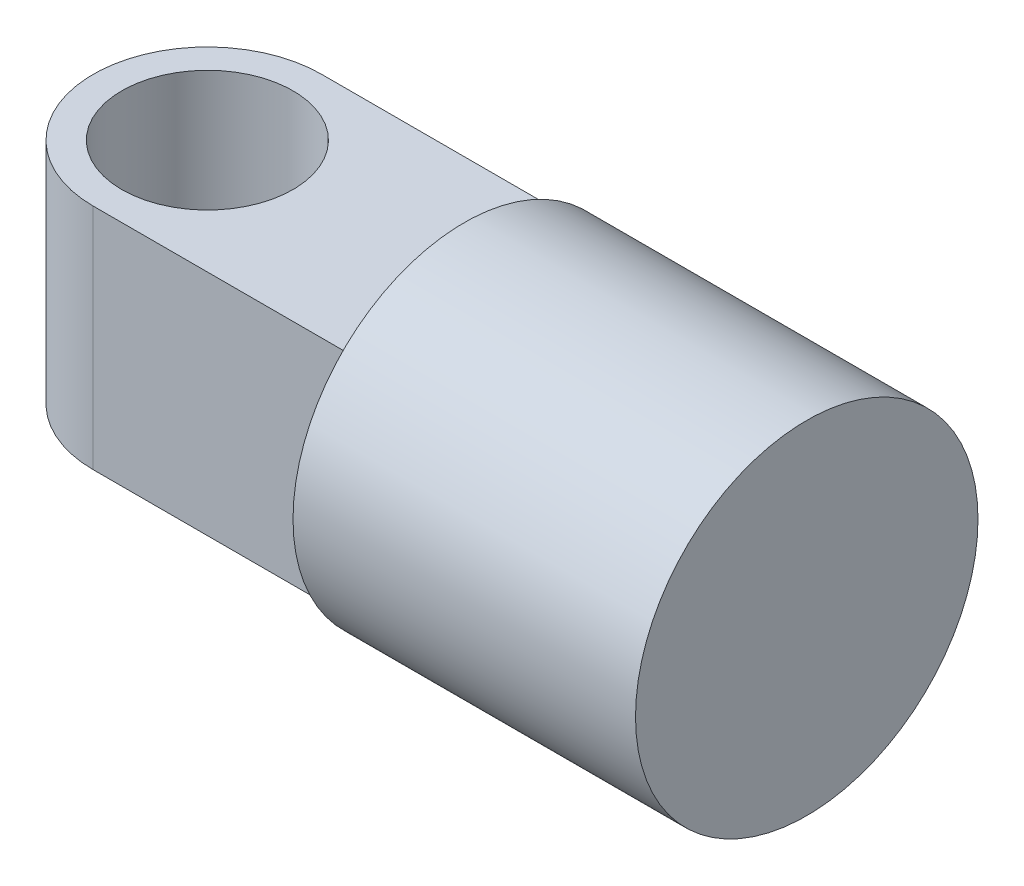
ISO-10303-21;
HEADER;
FILE_DESCRIPTION(('STEP AP214'),'2;1');
FILE_NAME('part.step','',(''),(''),'','','');
FILE_SCHEMA(('AUTOMOTIVE_DESIGN { 1 0 10303 214 1 1 1 1 }'));
ENDSEC;
DATA;
#1=APPLICATION_CONTEXT('core data for automotive mechanical design processes');
#2=APPLICATION_PROTOCOL_DEFINITION('international standard','automotive_design',2000,#1);
#3=PRODUCT_CONTEXT('',#1,'mechanical');
#4=PRODUCT('Part','Part','',(#3));
#5=PRODUCT_RELATED_PRODUCT_CATEGORY('part','',(#4));
#6=PRODUCT_DEFINITION_FORMATION('','',#4);
#7=PRODUCT_DEFINITION_CONTEXT('part definition',#1,'design');
#8=PRODUCT_DEFINITION('design','',#6,#7);
#9=PRODUCT_DEFINITION_SHAPE('','',#8);
#10=(LENGTH_UNIT() NAMED_UNIT(*) SI_UNIT(.MILLI.,.METRE.));
#11=(NAMED_UNIT(*) PLANE_ANGLE_UNIT() SI_UNIT($,.RADIAN.));
#12=(NAMED_UNIT(*) SI_UNIT($,.STERADIAN.) SOLID_ANGLE_UNIT());
#13=UNCERTAINTY_MEASURE_WITH_UNIT(LENGTH_MEASURE(1.E-05),#10,'distance_accuracy_value','');
#14=(GEOMETRIC_REPRESENTATION_CONTEXT(3) GLOBAL_UNCERTAINTY_ASSIGNED_CONTEXT((#13)) GLOBAL_UNIT_ASSIGNED_CONTEXT((#10,
#11,#12)) REPRESENTATION_CONTEXT('',''));
#15=CARTESIAN_POINT('',(0.,0.,0.));
#16=DIRECTION('',(0.,0.,1.));
#17=DIRECTION('',(1.,0.,0.));
#18=AXIS2_PLACEMENT_3D('',#15,#16,#17);
#19=CARTESIAN_POINT('',(0.,50.8,-25.4));
#20=DIRECTION('',(0.,0.,-1.));
#21=DIRECTION('',(-1.,0.,0.));
#22=AXIS2_PLACEMENT_3D('',#19,#20,#21);
#23=PLANE('',#22);
#24=DIRECTION('',(1.,0.,0.));
#25=VECTOR('',#24,1.);
#26=CARTESIAN_POINT('',(0.,0.,-25.4));
#27=LINE('',#26,#25);
#28=CARTESIAN_POINT('',(0.,0.,-25.4));
#29=VERTEX_POINT('',#28);
#30=CARTESIAN_POINT('',(57.15,0.,-25.4));
#31=VERTEX_POINT('',#30);
#32=EDGE_CURVE('E85',#29,#31,#27,.T.);
#33=ORIENTED_EDGE('',*,*,#32,.F.);
#34=DIRECTION('',(0.,-1.,0.));
#35=VECTOR('',#34,1.);
#36=CARTESIAN_POINT('',(0.,50.8,-25.4));
#37=LINE('',#36,#35);
#38=CARTESIAN_POINT('',(0.,50.8,-25.4));
#39=VERTEX_POINT('',#38);
#40=EDGE_CURVE('E11',#39,#29,#37,.T.);
#41=ORIENTED_EDGE('',*,*,#40,.F.);
#42=DIRECTION('',(1.,0.,0.));
#43=VECTOR('',#42,1.);
#44=CARTESIAN_POINT('',(0.,50.8,-25.4));
#45=LINE('',#44,#43);
#46=CARTESIAN_POINT('',(57.15,50.8,-25.4));
#47=VERTEX_POINT('',#46);
#48=EDGE_CURVE('E51',#39,#47,#45,.T.);
#49=ORIENTED_EDGE('',*,*,#48,.T.);
#50=DIRECTION('',(0.,-1.,0.));
#51=VECTOR('',#50,1.);
#52=CARTESIAN_POINT('',(57.15,50.8,-25.4));
#53=LINE('',#52,#51);
#54=EDGE_CURVE('E70',#47,#31,#53,.T.);
#55=ORIENTED_EDGE('',*,*,#54,.T.);
#56=EDGE_LOOP('',(#33,#41,#49,#55));
#57=FACE_BOUND('',#56,.T.);
#58=ADVANCED_FACE('F35',(#57),#23,.T.);
#59=CARTESIAN_POINT('',(0.,50.8,0.));
#60=DIRECTION('',(0.,-1.,0.));
#61=DIRECTION('',(0.,0.,-1.));
#62=AXIS2_PLACEMENT_3D('',#59,#60,#61);
#63=CYLINDRICAL_SURFACE('',#62,25.4);
#64=CARTESIAN_POINT('',(0.,0.,0.));
#65=DIRECTION('',(0.,1.,0.));
#66=DIRECTION('',(0.,0.,1.));
#67=AXIS2_PLACEMENT_3D('',#64,#65,#66);
#68=CIRCLE('',#67,25.4);
#69=CARTESIAN_POINT('',(0.,0.,25.4));
#70=VERTEX_POINT('',#69);
#71=EDGE_CURVE('E65',#29,#70,#68,.T.);
#72=ORIENTED_EDGE('',*,*,#71,.T.);
#73=DIRECTION('',(0.,-1.,0.));
#74=VECTOR('',#73,1.);
#75=CARTESIAN_POINT('',(0.,50.8,25.4));
#76=LINE('',#75,#74);
#77=CARTESIAN_POINT('',(0.,50.8,25.4));
#78=VERTEX_POINT('',#77);
#79=EDGE_CURVE('E43',#78,#70,#76,.T.);
#80=ORIENTED_EDGE('',*,*,#79,.F.);
#81=CARTESIAN_POINT('',(0.,50.8,0.));
#82=DIRECTION('',(0.,1.,0.));
#83=DIRECTION('',(0.,0.,1.));
#84=AXIS2_PLACEMENT_3D('',#81,#82,#83);
#85=CIRCLE('',#84,25.4);
#86=EDGE_CURVE('E114',#39,#78,#85,.T.);
#87=ORIENTED_EDGE('',*,*,#86,.F.);
#88=ORIENTED_EDGE('',*,*,#40,.T.);
#89=EDGE_LOOP('',(#72,#80,#87,#88));
#90=FACE_BOUND('',#89,.T.);
#91=ADVANCED_FACE('F137',(#90),#63,.T.);
#92=CARTESIAN_POINT('',(0.,50.8,25.4));
#93=DIRECTION('',(0.,0.,-1.));
#94=DIRECTION('',(-1.,0.,0.));
#95=AXIS2_PLACEMENT_3D('',#92,#93,#94);
#96=PLANE('',#95);
#97=DIRECTION('',(1.,0.,0.));
#98=VECTOR('',#97,1.);
#99=CARTESIAN_POINT('',(0.,0.,25.4));
#100=LINE('',#99,#98);
#101=CARTESIAN_POINT('',(57.15,0.,25.4));
#102=VERTEX_POINT('',#101);
#103=EDGE_CURVE('E84',#70,#102,#100,.T.);
#104=ORIENTED_EDGE('',*,*,#103,.T.);
#105=DIRECTION('',(0.,-1.,0.));
#106=VECTOR('',#105,1.);
#107=CARTESIAN_POINT('',(57.15,50.8,25.4));
#108=LINE('',#107,#106);
#109=CARTESIAN_POINT('',(57.15,50.8,25.4));
#110=VERTEX_POINT('',#109);
#111=EDGE_CURVE('E94',#110,#102,#108,.T.);
#112=ORIENTED_EDGE('',*,*,#111,.F.);
#113=DIRECTION('',(1.,0.,0.));
#114=VECTOR('',#113,1.);
#115=CARTESIAN_POINT('',(0.,50.8,25.4));
#116=LINE('',#115,#114);
#117=EDGE_CURVE('E112',#78,#110,#116,.T.);
#118=ORIENTED_EDGE('',*,*,#117,.F.);
#119=ORIENTED_EDGE('',*,*,#79,.T.);
#120=EDGE_LOOP('',(#104,#112,#118,#119));
#121=FACE_BOUND('',#120,.T.);
#122=ADVANCED_FACE('F92',(#121),#96,.F.);
#123=CARTESIAN_POINT('',(0.,50.8,0.));
#124=DIRECTION('',(0.,-1.,0.));
#125=DIRECTION('',(0.,0.,-1.));
#126=AXIS2_PLACEMENT_3D('',#123,#124,#125);
#127=CYLINDRICAL_SURFACE('',#126,19.05);
#128=CARTESIAN_POINT('',(0.,50.8,0.));
#129=DIRECTION('',(0.,1.,0.));
#130=DIRECTION('',(0.,0.,1.));
#131=AXIS2_PLACEMENT_3D('',#128,#129,#130);
#132=CIRCLE('',#131,19.05);
#133=CARTESIAN_POINT('',(0.,50.8,19.05));
#134=VERTEX_POINT('',#133);
#135=EDGE_CURVE('E101',#134,#134,#132,.T.);
#136=ORIENTED_EDGE('',*,*,#135,.T.);
#137=EDGE_LOOP('',(#136));
#138=FACE_BOUND('',#137,.T.);
#139=CARTESIAN_POINT('',(0.,0.,0.));
#140=DIRECTION('',(0.,1.,0.));
#141=DIRECTION('',(0.,0.,1.));
#142=AXIS2_PLACEMENT_3D('',#139,#140,#141);
#143=CIRCLE('',#142,19.05);
#144=CARTESIAN_POINT('',(0.,0.,19.05));
#145=VERTEX_POINT('',#144);
#146=EDGE_CURVE('E88',#145,#145,#143,.T.);
#147=ORIENTED_EDGE('',*,*,#146,.F.);
#148=EDGE_LOOP('',(#147));
#149=FACE_BOUND('',#148,.T.);
#150=ADVANCED_FACE('F144',(#138,#149),#127,.F.);
#151=CARTESIAN_POINT('',(0.,50.8,0.));
#152=DIRECTION('',(0.,1.,0.));
#153=DIRECTION('',(0.,0.,1.));
#154=AXIS2_PLACEMENT_3D('',#151,#152,#153);
#155=PLANE('',#154);
#156=ORIENTED_EDGE('',*,*,#48,.F.);
#157=ORIENTED_EDGE('',*,*,#86,.T.);
#158=ORIENTED_EDGE('',*,*,#117,.T.);
#159=DIRECTION('',(0.,0.,1.));
#160=VECTOR('',#159,1.);
#161=CARTESIAN_POINT('',(57.15,50.8,0.));
#162=LINE('',#161,#160);
#163=EDGE_CURVE('E99',#47,#110,#162,.T.);
#164=ORIENTED_EDGE('',*,*,#163,.F.);
#165=EDGE_LOOP('',(#156,#157,#158,#164));
#166=FACE_BOUND('',#165,.T.);
#167=ORIENTED_EDGE('',*,*,#135,.F.);
#168=EDGE_LOOP('',(#167));
#169=FACE_BOUND('',#168,.T.);
#170=ADVANCED_FACE('F149',(#166,#169),#155,.T.);
#171=CARTESIAN_POINT('',(0.,0.,0.));
#172=DIRECTION('',(0.,1.,0.));
#173=DIRECTION('',(0.,0.,1.));
#174=AXIS2_PLACEMENT_3D('',#171,#172,#173);
#175=PLANE('',#174);
#176=ORIENTED_EDGE('',*,*,#32,.T.);
#177=DIRECTION('',(0.,0.,1.));
#178=VECTOR('',#177,1.);
#179=CARTESIAN_POINT('',(57.15,0.,0.));
#180=LINE('',#179,#178);
#181=EDGE_CURVE('E80',#31,#102,#180,.T.);
#182=ORIENTED_EDGE('',*,*,#181,.T.);
#183=ORIENTED_EDGE('',*,*,#103,.F.);
#184=ORIENTED_EDGE('',*,*,#71,.F.);
#185=EDGE_LOOP('',(#176,#182,#183,#184));
#186=FACE_BOUND('',#185,.T.);
#187=ORIENTED_EDGE('',*,*,#146,.T.);
#188=EDGE_LOOP('',(#187));
#189=FACE_BOUND('',#188,.T.);
#190=ADVANCED_FACE('F82',(#186,#189),#175,.F.);
#191=CARTESIAN_POINT('',(133.35,25.4,0.));
#192=DIRECTION('',(-1.,0.,0.));
#193=DIRECTION('',(0.,0.,1.));
#194=AXIS2_PLACEMENT_3D('',#191,#192,#193);
#195=CYLINDRICAL_SURFACE('',#194,38.1);
#196=CARTESIAN_POINT('',(133.35,25.4,0.));
#197=DIRECTION('',(1.,0.,0.));
#198=DIRECTION('',(0.,0.,-1.));
#199=AXIS2_PLACEMENT_3D('',#196,#197,#198);
#200=CIRCLE('',#199,38.1);
#201=CARTESIAN_POINT('',(133.35,25.4,38.1));
#202=VERTEX_POINT('',#201);
#203=EDGE_CURVE('E108',#202,#202,#200,.T.);
#204=CARTESIAN_POINT('',(57.15,25.4,0.));
#205=DIRECTION('',(1.,0.,0.));
#206=DIRECTION('',(0.,0.,-1.));
#207=AXIS2_PLACEMENT_3D('',#204,#205,#206);
#208=CIRCLE('',#207,38.1);
#209=CARTESIAN_POINT('',(57.15,25.4,38.1));
#210=VERTEX_POINT('',#209);
#211=EDGE_CURVE('E117',#210,#210,#208,.T.);
#212=CARTESIAN_POINT('',(133.35,25.4,38.1));
#213=CARTESIAN_POINT('',(132.55625,25.4,38.1));
#214=CARTESIAN_POINT('',(131.7625,25.4,38.1));
#215=CARTESIAN_POINT('',(130.175,25.4,38.1));
#216=CARTESIAN_POINT('',(129.38125,25.4,38.1));
#217=CARTESIAN_POINT('',(127.79375,25.4,38.1));
#218=CARTESIAN_POINT('',(127.,25.4,38.1));
#219=CARTESIAN_POINT('',(125.4125,25.4,38.1));
#220=CARTESIAN_POINT('',(124.61875,25.4,38.1));
#221=CARTESIAN_POINT('',(123.03125,25.4,38.1));
#222=CARTESIAN_POINT('',(122.2375,25.4,38.1));
#223=CARTESIAN_POINT('',(120.65,25.4,38.1));
#224=CARTESIAN_POINT('',(119.85625,25.4,38.1));
#225=CARTESIAN_POINT('',(118.26875,25.4,38.1));
#226=CARTESIAN_POINT('',(117.475,25.4,38.1));
#227=CARTESIAN_POINT('',(115.8875,25.4,38.1));
#228=CARTESIAN_POINT('',(115.09375,25.4,38.1));
#229=CARTESIAN_POINT('',(113.50625,25.4,38.1));
#230=CARTESIAN_POINT('',(112.7125,25.4,38.1));
#231=CARTESIAN_POINT('',(111.125,25.4,38.1));
#232=CARTESIAN_POINT('',(110.33125,25.4,38.1));
#233=CARTESIAN_POINT('',(108.74375,25.4,38.1));
#234=CARTESIAN_POINT('',(107.95,25.4,38.1));
#235=CARTESIAN_POINT('',(106.3625,25.4,38.1));
#236=CARTESIAN_POINT('',(105.56875,25.4,38.1));
#237=CARTESIAN_POINT('',(103.98125,25.4,38.1));
#238=CARTESIAN_POINT('',(103.1875,25.4,38.1));
#239=CARTESIAN_POINT('',(101.6,25.4,38.1));
#240=CARTESIAN_POINT('',(100.80625,25.4,38.1));
#241=CARTESIAN_POINT('',(99.21875,25.4,38.1));
#242=CARTESIAN_POINT('',(98.425,25.4,38.1));
#243=CARTESIAN_POINT('',(96.8375,25.4,38.1));
#244=CARTESIAN_POINT('',(96.04375,25.4,38.1));
#245=CARTESIAN_POINT('',(94.45625,25.4,38.1));
#246=CARTESIAN_POINT('',(93.6625,25.4,38.1));
#247=CARTESIAN_POINT('',(92.075,25.4,38.1));
#248=CARTESIAN_POINT('',(91.28125,25.4,38.1));
#249=CARTESIAN_POINT('',(89.69375,25.4,38.1));
#250=CARTESIAN_POINT('',(88.9,25.4,38.1));
#251=CARTESIAN_POINT('',(87.3125,25.4,38.1));
#252=CARTESIAN_POINT('',(86.51875,25.4,38.1));
#253=CARTESIAN_POINT('',(84.93125,25.4,38.1));
#254=CARTESIAN_POINT('',(84.1375,25.4,38.1));
#255=CARTESIAN_POINT('',(82.55,25.4,38.1));
#256=CARTESIAN_POINT('',(81.75625,25.4,38.1));
#257=CARTESIAN_POINT('',(80.16875,25.4,38.1));
#258=CARTESIAN_POINT('',(79.375,25.4,38.1));
#259=CARTESIAN_POINT('',(77.7875,25.4,38.1));
#260=CARTESIAN_POINT('',(76.99375,25.4,38.1));
#261=CARTESIAN_POINT('',(75.40625,25.4,38.1));
#262=CARTESIAN_POINT('',(74.6125,25.4,38.1));
#263=CARTESIAN_POINT('',(73.025,25.4,38.1));
#264=CARTESIAN_POINT('',(72.23125,25.4,38.1));
#265=CARTESIAN_POINT('',(70.64375,25.4,38.1));
#266=CARTESIAN_POINT('',(69.85,25.4,38.1));
#267=CARTESIAN_POINT('',(68.2625,25.4,38.1));
#268=CARTESIAN_POINT('',(67.46875,25.4,38.1));
#269=CARTESIAN_POINT('',(65.88125,25.4,38.1));
#270=CARTESIAN_POINT('',(65.0875,25.4,38.1));
#271=CARTESIAN_POINT('',(63.5,25.4,38.1));
#272=CARTESIAN_POINT('',(62.70625,25.4,38.1));
#273=CARTESIAN_POINT('',(61.11875,25.4,38.1));
#274=CARTESIAN_POINT('',(60.325,25.4,38.1));
#275=CARTESIAN_POINT('',(58.7375,25.4,38.1));
#276=CARTESIAN_POINT('',(57.94375,25.4,38.1));
#277=CARTESIAN_POINT('',(57.15,25.4,38.1));
#278=B_SPLINE_CURVE_WITH_KNOTS('',3,(#212,#213,#214,#215,#216,#217,#218,#219,#220,#221,#222,
#223,#224,#225,#226,#227,#228,#229,#230,#231,#232,#233,#234,#235,#236,#237,#238,#239,#240,#241,
#242,#243,#244,#245,#246,#247,#248,#249,#250,#251,#252,#253,#254,#255,#256,#257,#258,#259,#260,
#261,#262,#263,#264,#265,#266,#267,#268,#269,#270,#271,#272,#273,#274,#275,#276,#277),
.UNSPECIFIED.,.F.,.F.,(4,2,2,2,2,2,2,2,2,2,2,2,2,2,2,2,2,2,2,2,2,2,2,2,2,2,2,2,2,2,2,2,4),(0.,
2.38125,4.7625,7.14375,9.52500000000002,11.90625,14.2875,16.66875,19.05,21.43125,23.8125,
26.19375,28.575,30.95625,33.3375,35.71875,38.1,40.48125,42.8625,45.24375,47.625,50.00625,
52.3875,54.76875,57.15,59.53125,61.9125,64.29375,66.675,69.05625,71.4375,73.81875,76.2),.UNSPECIFIED.);
#279=EDGE_CURVE('BSEAM125',#202,#210,#278,.T.);
#280=ORIENTED_EDGE('',*,*,#203,.F.);
#281=ORIENTED_EDGE('',*,*,#211,.T.);
#282=ORIENTED_EDGE('',*,*,#279,.T.);
#283=ORIENTED_EDGE('',*,*,#279,.F.);
#284=EDGE_LOOP('',(#280,#282,#281,#283));
#285=FACE_BOUND('',#284,.T.);
#286=ADVANCED_FACE('F125',(#285),#195,.T.);
#287=CARTESIAN_POINT('',(133.35,25.4,0.));
#288=DIRECTION('',(1.,0.,0.));
#289=DIRECTION('',(0.,0.,-1.));
#290=AXIS2_PLACEMENT_3D('',#287,#288,#289);
#291=PLANE('',#290);
#292=ORIENTED_EDGE('',*,*,#203,.T.);
#293=EDGE_LOOP('',(#292));
#294=FACE_BOUND('',#293,.T.);
#295=ADVANCED_FACE('F123',(#294),#291,.T.);
#296=CARTESIAN_POINT('',(57.15,25.4,0.));
#297=DIRECTION('',(1.,0.,0.));
#298=DIRECTION('',(0.,0.,-1.));
#299=AXIS2_PLACEMENT_3D('',#296,#297,#298);
#300=PLANE('',#299);
#301=ORIENTED_EDGE('',*,*,#181,.F.);
#302=ORIENTED_EDGE('',*,*,#54,.F.);
#303=ORIENTED_EDGE('',*,*,#163,.T.);
#304=ORIENTED_EDGE('',*,*,#111,.T.);
#305=EDGE_LOOP('',(#301,#302,#303,#304));
#306=FACE_BOUND('',#305,.T.);
#307=ORIENTED_EDGE('',*,*,#211,.F.);
#308=EDGE_LOOP('',(#307));
#309=FACE_BOUND('',#308,.T.);
#310=ADVANCED_FACE('F97',(#306,#309),#300,.F.);
#311=CLOSED_SHELL('',(#58,#91,#122,#150,#170,#190,#286,#295,#310));
#312=MANIFOLD_SOLID_BREP('B2',#311);
#313=ADVANCED_BREP_SHAPE_REPRESENTATION('',(#18,#312),#14);
#314=SHAPE_DEFINITION_REPRESENTATION(#9,#313);
ENDSEC;
END-ISO-10303-21;
